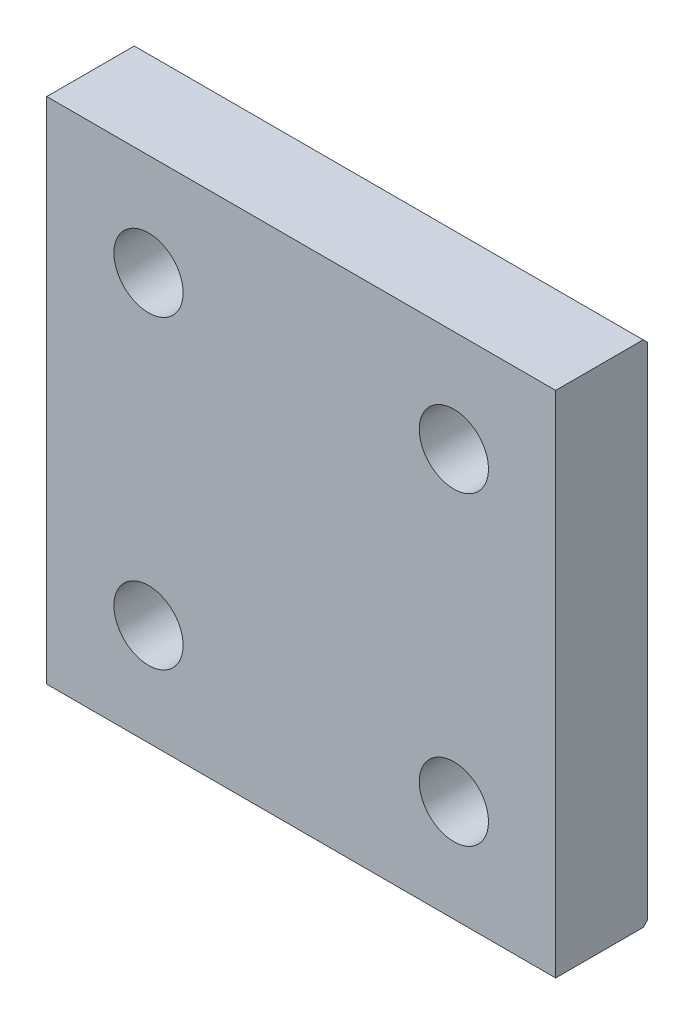
ISO-10303-21;
HEADER;
FILE_DESCRIPTION(('STEP AP214'),'2;1');
FILE_NAME('part.step','',(''),(''),'','','');
FILE_SCHEMA(('AUTOMOTIVE_DESIGN { 1 0 10303 214 1 1 1 1 }'));
ENDSEC;
DATA;
#1=APPLICATION_CONTEXT('core data for automotive mechanical design processes');
#2=APPLICATION_PROTOCOL_DEFINITION('international standard','automotive_design',2000,#1);
#3=PRODUCT_CONTEXT('',#1,'mechanical');
#4=PRODUCT('Part','Part','',(#3));
#5=PRODUCT_RELATED_PRODUCT_CATEGORY('part','',(#4));
#6=PRODUCT_DEFINITION_FORMATION('','',#4);
#7=PRODUCT_DEFINITION_CONTEXT('part definition',#1,'design');
#8=PRODUCT_DEFINITION('design','',#6,#7);
#9=PRODUCT_DEFINITION_SHAPE('','',#8);
#10=(LENGTH_UNIT() NAMED_UNIT(*) SI_UNIT(.MILLI.,.METRE.));
#11=(NAMED_UNIT(*) PLANE_ANGLE_UNIT() SI_UNIT($,.RADIAN.));
#12=(NAMED_UNIT(*) SI_UNIT($,.STERADIAN.) SOLID_ANGLE_UNIT());
#13=UNCERTAINTY_MEASURE_WITH_UNIT(LENGTH_MEASURE(1.E-05),#10,'distance_accuracy_value','');
#14=(GEOMETRIC_REPRESENTATION_CONTEXT(3) GLOBAL_UNCERTAINTY_ASSIGNED_CONTEXT((#13)) GLOBAL_UNIT_ASSIGNED_CONTEXT((#10,
#11,#12)) REPRESENTATION_CONTEXT('',''));
#15=CARTESIAN_POINT('',(0.,0.,0.));
#16=DIRECTION('',(0.,0.,1.));
#17=DIRECTION('',(1.,0.,0.));
#18=AXIS2_PLACEMENT_3D('',#15,#16,#17);
#19=CARTESIAN_POINT('',(-7.5,-7.5,4.5));
#20=DIRECTION('',(0.,0.,-1.));
#21=DIRECTION('',(-1.,0.,0.));
#22=AXIS2_PLACEMENT_3D('',#19,#20,#21);
#23=CYLINDRICAL_SURFACE('',#22,1.7);
#24=CARTESIAN_POINT('',(-7.5,-7.5,0.200000000000005));
#25=DIRECTION('',(0.,0.,1.));
#26=DIRECTION('',(1.,0.,0.));
#27=AXIS2_PLACEMENT_3D('',#24,#25,#26);
#28=CIRCLE('',#27,1.7);
#29=CARTESIAN_POINT('',(-9.2,-7.5,0.200000000000005));
#30=VERTEX_POINT('',#29);
#31=EDGE_CURVE('E157',#30,#30,#28,.F.);
#32=ORIENTED_EDGE('',*,*,#31,.T.);
#33=EDGE_LOOP('',(#32));
#34=FACE_BOUND('',#33,.T.);
#35=CARTESIAN_POINT('',(-7.5,-7.5,4.5));
#36=DIRECTION('',(0.,0.,-1.));
#37=DIRECTION('',(-1.,0.,0.));
#38=AXIS2_PLACEMENT_3D('',#35,#36,#37);
#39=CIRCLE('',#38,1.7);
#40=CARTESIAN_POINT('',(-9.2,-7.5,4.5));
#41=VERTEX_POINT('',#40);
#42=EDGE_CURVE('E123',#41,#41,#39,.T.);
#43=ORIENTED_EDGE('',*,*,#42,.F.);
#44=EDGE_LOOP('',(#43));
#45=FACE_BOUND('',#44,.T.);
#46=ADVANCED_FACE('F37',(#34,#45),#23,.F.);
#47=CARTESIAN_POINT('',(7.5,-7.5,4.5));
#48=DIRECTION('',(0.,0.,-1.));
#49=DIRECTION('',(-1.,0.,0.));
#50=AXIS2_PLACEMENT_3D('',#47,#48,#49);
#51=CYLINDRICAL_SURFACE('',#50,1.7);
#52=CARTESIAN_POINT('',(7.5,-7.5,0.200000000000005));
#53=DIRECTION('',(0.,0.,1.));
#54=DIRECTION('',(1.,0.,0.));
#55=AXIS2_PLACEMENT_3D('',#52,#53,#54);
#56=CIRCLE('',#55,1.7);
#57=CARTESIAN_POINT('',(5.8,-7.5,0.200000000000005));
#58=VERTEX_POINT('',#57);
#59=EDGE_CURVE('E154',#58,#58,#56,.F.);
#60=ORIENTED_EDGE('',*,*,#59,.T.);
#61=EDGE_LOOP('',(#60));
#62=FACE_BOUND('',#61,.T.);
#63=CARTESIAN_POINT('',(7.5,-7.5,4.5));
#64=DIRECTION('',(0.,0.,-1.));
#65=DIRECTION('',(-1.,0.,0.));
#66=AXIS2_PLACEMENT_3D('',#63,#64,#65);
#67=CIRCLE('',#66,1.7);
#68=CARTESIAN_POINT('',(5.8,-7.5,4.5));
#69=VERTEX_POINT('',#68);
#70=EDGE_CURVE('E120',#69,#69,#67,.T.);
#71=ORIENTED_EDGE('',*,*,#70,.F.);
#72=EDGE_LOOP('',(#71));
#73=FACE_BOUND('',#72,.T.);
#74=ADVANCED_FACE('F182',(#62,#73),#51,.F.);
#75=CARTESIAN_POINT('',(-12.5,-12.5,4.5));
#76=DIRECTION('',(1.,0.,0.));
#77=DIRECTION('',(0.,0.,-1.));
#78=AXIS2_PLACEMENT_3D('',#75,#76,#77);
#79=PLANE('',#78);
#80=DIRECTION('',(0.,-1.,0.));
#81=VECTOR('',#80,1.);
#82=CARTESIAN_POINT('',(-12.5,-12.5,0.));
#83=LINE('',#82,#81);
#84=CARTESIAN_POINT('',(-12.5,12.3,0.));
#85=VERTEX_POINT('',#84);
#86=CARTESIAN_POINT('',(-12.5,-12.3,0.));
#87=VERTEX_POINT('',#86);
#88=EDGE_CURVE('E236',#85,#87,#83,.T.);
#89=ORIENTED_EDGE('',*,*,#88,.T.);
#90=DIRECTION('',(0.,0.707106781186548,-0.707106781186548));
#91=VECTOR('',#90,1.);
#92=CARTESIAN_POINT('',(-12.5,-12.5,0.200000000000001));
#93=LINE('',#92,#91);
#94=CARTESIAN_POINT('',(-12.5,-12.5,0.200000000000002));
#95=VERTEX_POINT('',#94);
#96=EDGE_CURVE('E119',#87,#95,#93,.F.);
#97=ORIENTED_EDGE('',*,*,#96,.T.);
#98=DIRECTION('',(0.,0.,-1.));
#99=VECTOR('',#98,1.);
#100=CARTESIAN_POINT('',(-12.5,-12.5,4.5));
#101=LINE('',#100,#99);
#102=CARTESIAN_POINT('',(-12.5,-12.5,4.5));
#103=VERTEX_POINT('',#102);
#104=EDGE_CURVE('E98',#103,#95,#101,.T.);
#105=ORIENTED_EDGE('',*,*,#104,.F.);
#106=DIRECTION('',(0.,-1.,0.));
#107=VECTOR('',#106,1.);
#108=CARTESIAN_POINT('',(-12.5,-12.5,4.5));
#109=LINE('',#108,#107);
#110=CARTESIAN_POINT('',(-12.5,12.5,4.5));
#111=VERTEX_POINT('',#110);
#112=EDGE_CURVE('E105',#111,#103,#109,.T.);
#113=ORIENTED_EDGE('',*,*,#112,.F.);
#114=DIRECTION('',(0.,0.,-1.));
#115=VECTOR('',#114,1.);
#116=CARTESIAN_POINT('',(-12.5,12.5,4.5));
#117=LINE('',#116,#115);
#118=CARTESIAN_POINT('',(-12.5,12.5,0.200000000000002));
#119=VERTEX_POINT('',#118);
#120=EDGE_CURVE('E242',#111,#119,#117,.T.);
#121=ORIENTED_EDGE('',*,*,#120,.T.);
#122=DIRECTION('',(0.,0.707106781186548,0.707106781186548));
#123=VECTOR('',#122,1.);
#124=CARTESIAN_POINT('',(-12.5,12.5,0.200000000000004));
#125=LINE('',#124,#123);
#126=EDGE_CURVE('E53',#119,#85,#125,.F.);
#127=ORIENTED_EDGE('',*,*,#126,.T.);
#128=EDGE_LOOP('',(#89,#97,#105,#113,#121,#127));
#129=FACE_BOUND('',#128,.T.);
#130=ADVANCED_FACE('F117',(#129),#79,.F.);
#131=CARTESIAN_POINT('',(12.5,-12.5,4.5));
#132=DIRECTION('',(0.,1.,0.));
#133=DIRECTION('',(-1.,0.,0.));
#134=AXIS2_PLACEMENT_3D('',#131,#132,#133);
#135=PLANE('',#134);
#136=ORIENTED_EDGE('',*,*,#104,.T.);
#137=DIRECTION('',(1.,0.,0.));
#138=VECTOR('',#137,1.);
#139=CARTESIAN_POINT('',(12.5,-12.5,0.200000000000002));
#140=LINE('',#139,#138);
#141=CARTESIAN_POINT('',(12.5,-12.5,0.200000000000002));
#142=VERTEX_POINT('',#141);
#143=EDGE_CURVE('E131',#95,#142,#140,.T.);
#144=ORIENTED_EDGE('',*,*,#143,.T.);
#145=DIRECTION('',(0.,0.,-1.));
#146=VECTOR('',#145,1.);
#147=CARTESIAN_POINT('',(12.5,-12.5,4.5));
#148=LINE('',#147,#146);
#149=CARTESIAN_POINT('',(12.5,-12.5,4.5));
#150=VERTEX_POINT('',#149);
#151=EDGE_CURVE('E101',#150,#142,#148,.T.);
#152=ORIENTED_EDGE('',*,*,#151,.F.);
#153=DIRECTION('',(1.,0.,0.));
#154=VECTOR('',#153,1.);
#155=CARTESIAN_POINT('',(12.5,-12.5,4.5));
#156=LINE('',#155,#154);
#157=EDGE_CURVE('E93',#103,#150,#156,.T.);
#158=ORIENTED_EDGE('',*,*,#157,.F.);
#159=EDGE_LOOP('',(#136,#144,#152,#158));
#160=FACE_BOUND('',#159,.T.);
#161=ADVANCED_FACE('F95',(#160),#135,.F.);
#162=CARTESIAN_POINT('',(12.5,-12.5,4.5));
#163=DIRECTION('',(-1.,0.,0.));
#164=DIRECTION('',(0.,0.,1.));
#165=AXIS2_PLACEMENT_3D('',#162,#163,#164);
#166=PLANE('',#165);
#167=ORIENTED_EDGE('',*,*,#151,.T.);
#168=DIRECTION('',(0.,-0.707106781186548,0.707106781186548));
#169=VECTOR('',#168,1.);
#170=CARTESIAN_POINT('',(12.5,-12.5,0.200000000000002));
#171=LINE('',#170,#169);
#172=CARTESIAN_POINT('',(12.5,-12.3,0.));
#173=VERTEX_POINT('',#172);
#174=EDGE_CURVE('E135',#142,#173,#171,.F.);
#175=ORIENTED_EDGE('',*,*,#174,.T.);
#176=DIRECTION('',(0.,1.,0.));
#177=VECTOR('',#176,1.);
#178=CARTESIAN_POINT('',(12.5,-12.5,0.));
#179=LINE('',#178,#177);
#180=CARTESIAN_POINT('',(12.5,12.3,0.));
#181=VERTEX_POINT('',#180);
#182=EDGE_CURVE('E115',#173,#181,#179,.T.);
#183=ORIENTED_EDGE('',*,*,#182,.T.);
#184=DIRECTION('',(0.,-0.707106781186548,-0.707106781186548));
#185=VECTOR('',#184,1.);
#186=CARTESIAN_POINT('',(12.5,12.5,0.200000000000002));
#187=LINE('',#186,#185);
#188=CARTESIAN_POINT('',(12.5,12.5,0.200000000000002));
#189=VERTEX_POINT('',#188);
#190=EDGE_CURVE('E133',#181,#189,#187,.F.);
#191=ORIENTED_EDGE('',*,*,#190,.T.);
#192=DIRECTION('',(0.,0.,-1.));
#193=VECTOR('',#192,1.);
#194=CARTESIAN_POINT('',(12.5,12.5,4.5));
#195=LINE('',#194,#193);
#196=CARTESIAN_POINT('',(12.5,12.5,4.5));
#197=VERTEX_POINT('',#196);
#198=EDGE_CURVE('E125',#197,#189,#195,.T.);
#199=ORIENTED_EDGE('',*,*,#198,.F.);
#200=DIRECTION('',(0.,1.,0.));
#201=VECTOR('',#200,1.);
#202=CARTESIAN_POINT('',(12.5,-12.5,4.5));
#203=LINE('',#202,#201);
#204=EDGE_CURVE('E104',#150,#197,#203,.T.);
#205=ORIENTED_EDGE('',*,*,#204,.F.);
#206=EDGE_LOOP('',(#167,#175,#183,#191,#199,#205));
#207=FACE_BOUND('',#206,.T.);
#208=ADVANCED_FACE('F238',(#207),#166,.F.);
#209=CARTESIAN_POINT('',(12.5,12.5,4.5));
#210=DIRECTION('',(0.,-1.,0.));
#211=DIRECTION('',(1.,0.,0.));
#212=AXIS2_PLACEMENT_3D('',#209,#210,#211);
#213=PLANE('',#212);
#214=ORIENTED_EDGE('',*,*,#198,.T.);
#215=DIRECTION('',(-1.,0.,0.));
#216=VECTOR('',#215,1.);
#217=CARTESIAN_POINT('',(12.5,12.5,0.200000000000002));
#218=LINE('',#217,#216);
#219=EDGE_CURVE('E11',#189,#119,#218,.T.);
#220=ORIENTED_EDGE('',*,*,#219,.T.);
#221=ORIENTED_EDGE('',*,*,#120,.F.);
#222=DIRECTION('',(-1.,0.,0.));
#223=VECTOR('',#222,1.);
#224=CARTESIAN_POINT('',(12.5,12.5,4.5));
#225=LINE('',#224,#223);
#226=EDGE_CURVE('E111',#197,#111,#225,.T.);
#227=ORIENTED_EDGE('',*,*,#226,.F.);
#228=EDGE_LOOP('',(#214,#220,#221,#227));
#229=FACE_BOUND('',#228,.T.);
#230=ADVANCED_FACE('F248',(#229),#213,.F.);
#231=CARTESIAN_POINT('',(0.,0.,4.5));
#232=DIRECTION('',(0.,0.,1.));
#233=DIRECTION('',(1.,0.,0.));
#234=AXIS2_PLACEMENT_3D('',#231,#232,#233);
#235=PLANE('',#234);
#236=CARTESIAN_POINT('',(-7.5,7.5,4.5));
#237=DIRECTION('',(0.,0.,-1.));
#238=DIRECTION('',(-1.,0.,0.));
#239=AXIS2_PLACEMENT_3D('',#236,#237,#238);
#240=CIRCLE('',#239,1.7);
#241=CARTESIAN_POINT('',(-9.2,7.5,4.5));
#242=VERTEX_POINT('',#241);
#243=EDGE_CURVE('E354',#242,#242,#240,.T.);
#244=ORIENTED_EDGE('',*,*,#243,.T.);
#245=EDGE_LOOP('',(#244));
#246=FACE_BOUND('',#245,.T.);
#247=CARTESIAN_POINT('',(7.5,7.5,4.5));
#248=DIRECTION('',(0.,0.,-1.));
#249=DIRECTION('',(-1.,0.,0.));
#250=AXIS2_PLACEMENT_3D('',#247,#248,#249);
#251=CIRCLE('',#250,1.7);
#252=CARTESIAN_POINT('',(5.8,7.5,4.5));
#253=VERTEX_POINT('',#252);
#254=EDGE_CURVE('E245',#253,#253,#251,.T.);
#255=ORIENTED_EDGE('',*,*,#254,.T.);
#256=EDGE_LOOP('',(#255));
#257=FACE_BOUND('',#256,.T.);
#258=ORIENTED_EDGE('',*,*,#112,.T.);
#259=ORIENTED_EDGE('',*,*,#157,.T.);
#260=ORIENTED_EDGE('',*,*,#204,.T.);
#261=ORIENTED_EDGE('',*,*,#226,.T.);
#262=EDGE_LOOP('',(#258,#259,#260,#261));
#263=FACE_BOUND('',#262,.T.);
#264=ORIENTED_EDGE('',*,*,#70,.T.);
#265=EDGE_LOOP('',(#264));
#266=FACE_BOUND('',#265,.T.);
#267=ORIENTED_EDGE('',*,*,#42,.T.);
#268=EDGE_LOOP('',(#267));
#269=FACE_BOUND('',#268,.T.);
#270=ADVANCED_FACE('F108',(#246,#257,#263,#266,#269),#235,.T.);
#271=CARTESIAN_POINT('',(0.,0.,0.));
#272=DIRECTION('',(0.,0.,1.));
#273=DIRECTION('',(1.,0.,0.));
#274=AXIS2_PLACEMENT_3D('',#271,#272,#273);
#275=PLANE('',#274);
#276=CARTESIAN_POINT('',(7.5,-7.5,0.));
#277=DIRECTION('',(0.,0.,1.));
#278=DIRECTION('',(1.,0.,0.));
#279=AXIS2_PLACEMENT_3D('',#276,#277,#278);
#280=CIRCLE('',#279,1.90000000000001);
#281=CARTESIAN_POINT('',(5.59999999999999,-7.5,0.));
#282=VERTEX_POINT('',#281);
#283=EDGE_CURVE('E148',#282,#282,#280,.T.);
#284=ORIENTED_EDGE('',*,*,#283,.T.);
#285=EDGE_LOOP('',(#284));
#286=FACE_BOUND('',#285,.T.);
#287=CARTESIAN_POINT('',(-7.5,-7.5,0.));
#288=DIRECTION('',(0.,0.,1.));
#289=DIRECTION('',(1.,0.,0.));
#290=AXIS2_PLACEMENT_3D('',#287,#288,#289);
#291=CIRCLE('',#290,1.90000000000001);
#292=CARTESIAN_POINT('',(-9.40000000000001,-7.5,0.));
#293=VERTEX_POINT('',#292);
#294=EDGE_CURVE('E145',#293,#293,#291,.T.);
#295=ORIENTED_EDGE('',*,*,#294,.T.);
#296=EDGE_LOOP('',(#295));
#297=FACE_BOUND('',#296,.T.);
#298=CARTESIAN_POINT('',(-7.5,7.5,0.));
#299=DIRECTION('',(0.,0.,1.));
#300=DIRECTION('',(1.,0.,0.));
#301=AXIS2_PLACEMENT_3D('',#298,#299,#300);
#302=CIRCLE('',#301,1.90000000000001);
#303=CARTESIAN_POINT('',(-9.40000000000001,7.5,0.));
#304=VERTEX_POINT('',#303);
#305=EDGE_CURVE('E142',#304,#304,#302,.T.);
#306=ORIENTED_EDGE('',*,*,#305,.T.);
#307=EDGE_LOOP('',(#306));
#308=FACE_BOUND('',#307,.T.);
#309=CARTESIAN_POINT('',(7.5,7.5,0.));
#310=DIRECTION('',(0.,0.,1.));
#311=DIRECTION('',(1.,0.,0.));
#312=AXIS2_PLACEMENT_3D('',#309,#310,#311);
#313=CIRCLE('',#312,1.90000000000001);
#314=CARTESIAN_POINT('',(5.59999999999999,7.5,0.));
#315=VERTEX_POINT('',#314);
#316=EDGE_CURVE('E139',#315,#315,#313,.T.);
#317=ORIENTED_EDGE('',*,*,#316,.T.);
#318=EDGE_LOOP('',(#317));
#319=FACE_BOUND('',#318,.T.);
#320=ORIENTED_EDGE('',*,*,#182,.F.);
#321=DIRECTION('',(-1.,0.,0.));
#322=VECTOR('',#321,1.);
#323=CARTESIAN_POINT('',(0.,-12.3,0.));
#324=LINE('',#323,#322);
#325=EDGE_CURVE('E60',#173,#87,#324,.T.);
#326=ORIENTED_EDGE('',*,*,#325,.T.);
#327=ORIENTED_EDGE('',*,*,#88,.F.);
#328=DIRECTION('',(1.,0.,0.));
#329=VECTOR('',#328,1.);
#330=CARTESIAN_POINT('',(0.,12.3,0.));
#331=LINE('',#330,#329);
#332=EDGE_CURVE('E137',#85,#181,#331,.T.);
#333=ORIENTED_EDGE('',*,*,#332,.T.);
#334=EDGE_LOOP('',(#320,#326,#327,#333));
#335=FACE_BOUND('',#334,.T.);
#336=ADVANCED_FACE('F226',(#286,#297,#308,#319,#335),#275,.F.);
#337=CARTESIAN_POINT('',(7.5,7.5,4.5));
#338=DIRECTION('',(0.,0.,-1.));
#339=DIRECTION('',(-1.,0.,0.));
#340=AXIS2_PLACEMENT_3D('',#337,#338,#339);
#341=CYLINDRICAL_SURFACE('',#340,1.7);
#342=CARTESIAN_POINT('',(7.5,7.5,0.200000000000005));
#343=DIRECTION('',(0.,0.,1.));
#344=DIRECTION('',(1.,0.,0.));
#345=AXIS2_PLACEMENT_3D('',#342,#343,#344);
#346=CIRCLE('',#345,1.7);
#347=CARTESIAN_POINT('',(5.8,7.5,0.200000000000005));
#348=VERTEX_POINT('',#347);
#349=EDGE_CURVE('E46',#348,#348,#346,.F.);
#350=ORIENTED_EDGE('',*,*,#349,.T.);
#351=EDGE_LOOP('',(#350));
#352=FACE_BOUND('',#351,.T.);
#353=ORIENTED_EDGE('',*,*,#254,.F.);
#354=EDGE_LOOP('',(#353));
#355=FACE_BOUND('',#354,.T.);
#356=ADVANCED_FACE('F165',(#352,#355),#341,.F.);
#357=CARTESIAN_POINT('',(-7.5,7.5,4.5));
#358=DIRECTION('',(0.,0.,-1.));
#359=DIRECTION('',(-1.,0.,0.));
#360=AXIS2_PLACEMENT_3D('',#357,#358,#359);
#361=CYLINDRICAL_SURFACE('',#360,1.7);
#362=CARTESIAN_POINT('',(-7.5,7.5,0.200000000000005));
#363=DIRECTION('',(0.,0.,1.));
#364=DIRECTION('',(1.,0.,0.));
#365=AXIS2_PLACEMENT_3D('',#362,#363,#364);
#366=CIRCLE('',#365,1.7);
#367=CARTESIAN_POINT('',(-9.2,7.5,0.200000000000005));
#368=VERTEX_POINT('',#367);
#369=EDGE_CURVE('E160',#368,#368,#366,.F.);
#370=ORIENTED_EDGE('',*,*,#369,.T.);
#371=EDGE_LOOP('',(#370));
#372=FACE_BOUND('',#371,.T.);
#373=ORIENTED_EDGE('',*,*,#243,.F.);
#374=EDGE_LOOP('',(#373));
#375=FACE_BOUND('',#374,.T.);
#376=ADVANCED_FACE('F201',(#372,#375),#361,.F.);
#377=CARTESIAN_POINT('',(12.5,-12.5,0.200000000000002));
#378=DIRECTION('',(0.,0.707106781186547,0.707106781186547));
#379=DIRECTION('',(1.,0.,0.));
#380=AXIS2_PLACEMENT_3D('',#377,#378,#379);
#381=PLANE('',#380);
#382=ORIENTED_EDGE('',*,*,#96,.F.);
#383=ORIENTED_EDGE('',*,*,#325,.F.);
#384=ORIENTED_EDGE('',*,*,#174,.F.);
#385=ORIENTED_EDGE('',*,*,#143,.F.);
#386=EDGE_LOOP('',(#382,#383,#384,#385));
#387=FACE_BOUND('',#386,.T.);
#388=ADVANCED_FACE('F194',(#387),#381,.F.);
#389=CARTESIAN_POINT('',(7.5,-7.5,0.200000000000005));
#390=DIRECTION('',(0.,0.,-1.));
#391=DIRECTION('',(-1.,0.,0.));
#392=AXIS2_PLACEMENT_3D('',#389,#390,#391);
#393=CONICAL_SURFACE('',#392,1.7,0.785398163397452);
#394=CARTESIAN_POINT('',(5.59999999999999,-7.5,0.));
#395=CARTESIAN_POINT('',(5.60208333333333,-7.5,0.00208333333333336));
#396=CARTESIAN_POINT('',(5.60416666666666,-7.5,0.00416666666666674));
#397=CARTESIAN_POINT('',(5.60833333333333,-7.5,0.00833333333333351));
#398=CARTESIAN_POINT('',(5.61041666666666,-7.5,0.0104166666666669));
#399=CARTESIAN_POINT('',(5.61458333333333,-7.5,0.0145833333333337));
#400=CARTESIAN_POINT('',(5.61666666666666,-7.5,0.016666666666667));
#401=CARTESIAN_POINT('',(5.62083333333333,-7.5,0.0208333333333338));
#402=CARTESIAN_POINT('',(5.62291666666666,-7.5,0.0229166666666672));
#403=CARTESIAN_POINT('',(5.62708333333333,-7.5,0.027083333333334));
#404=CARTESIAN_POINT('',(5.62916666666666,-7.5,0.0291666666666674));
#405=CARTESIAN_POINT('',(5.63333333333333,-7.5,0.0333333333333341));
#406=CARTESIAN_POINT('',(5.63541666666666,-7.5,0.0354166666666675));
#407=CARTESIAN_POINT('',(5.63958333333333,-7.5,0.0395833333333343));
#408=CARTESIAN_POINT('',(5.64166666666666,-7.5,0.0416666666666677));
#409=CARTESIAN_POINT('',(5.64583333333333,-7.5,0.0458333333333344));
#410=CARTESIAN_POINT('',(5.64791666666666,-7.5,0.0479166666666678));
#411=CARTESIAN_POINT('',(5.65208333333333,-7.5,0.0520833333333346));
#412=CARTESIAN_POINT('',(5.65416666666666,-7.5,0.054166666666668));
#413=CARTESIAN_POINT('',(5.65833333333333,-7.5,0.0583333333333347));
#414=CARTESIAN_POINT('',(5.66041666666666,-7.5,0.0604166666666681));
#415=CARTESIAN_POINT('',(5.66458333333333,-7.5,0.0645833333333349));
#416=CARTESIAN_POINT('',(5.66666666666666,-7.5,0.0666666666666683));
#417=CARTESIAN_POINT('',(5.67083333333333,-7.5,0.0708333333333351));
#418=CARTESIAN_POINT('',(5.67291666666666,-7.5,0.0729166666666684));
#419=CARTESIAN_POINT('',(5.67708333333333,-7.5,0.0770833333333352));
#420=CARTESIAN_POINT('',(5.67916666666666,-7.5,0.0791666666666686));
#421=CARTESIAN_POINT('',(5.68333333333333,-7.5,0.0833333333333353));
#422=CARTESIAN_POINT('',(5.68541666666666,-7.5,0.0854166666666687));
#423=CARTESIAN_POINT('',(5.68958333333333,-7.5,0.0895833333333355));
#424=CARTESIAN_POINT('',(5.69166666666666,-7.5,0.0916666666666689));
#425=CARTESIAN_POINT('',(5.69583333333333,-7.5,0.0958333333333356));
#426=CARTESIAN_POINT('',(5.69791666666666,-7.5,0.097916666666669));
#427=CARTESIAN_POINT('',(5.70208333333333,-7.5,0.102083333333336));
#428=CARTESIAN_POINT('',(5.70416666666666,-7.5,0.104166666666669));
#429=CARTESIAN_POINT('',(5.70833333333333,-7.5,0.108333333333336));
#430=CARTESIAN_POINT('',(5.71041666666666,-7.5,0.110416666666669));
#431=CARTESIAN_POINT('',(5.71458333333333,-7.5,0.114583333333336));
#432=CARTESIAN_POINT('',(5.71666666666667,-7.5,0.116666666666669));
#433=CARTESIAN_POINT('',(5.72083333333333,-7.5,0.120833333333336));
#434=CARTESIAN_POINT('',(5.72291666666666,-7.5,0.12291666666667));
#435=CARTESIAN_POINT('',(5.72708333333333,-7.5,0.127083333333337));
#436=CARTESIAN_POINT('',(5.72916666666667,-7.5,0.12916666666667));
#437=CARTESIAN_POINT('',(5.73333333333333,-7.5,0.133333333333336));
#438=CARTESIAN_POINT('',(5.73541666666666,-7.5,0.13541666666667));
#439=CARTESIAN_POINT('',(5.73958333333333,-7.5,0.139583333333337));
#440=CARTESIAN_POINT('',(5.74166666666667,-7.5,0.14166666666667));
#441=CARTESIAN_POINT('',(5.74583333333333,-7.5,0.145833333333337));
#442=CARTESIAN_POINT('',(5.74791666666667,-7.5,0.14791666666667));
#443=CARTESIAN_POINT('',(5.75208333333333,-7.5,0.152083333333337));
#444=CARTESIAN_POINT('',(5.75416666666667,-7.5,0.15416666666667));
#445=CARTESIAN_POINT('',(5.75833333333333,-7.5,0.158333333333337));
#446=CARTESIAN_POINT('',(5.76041666666667,-7.5,0.160416666666671));
#447=CARTESIAN_POINT('',(5.76458333333333,-7.5,0.164583333333337));
#448=CARTESIAN_POINT('',(5.76666666666667,-7.5,0.166666666666671));
#449=CARTESIAN_POINT('',(5.77083333333333,-7.5,0.170833333333337));
#450=CARTESIAN_POINT('',(5.77291666666667,-7.5,0.172916666666671));
#451=CARTESIAN_POINT('',(5.77708333333333,-7.5,0.177083333333338));
#452=CARTESIAN_POINT('',(5.77916666666667,-7.5,0.179166666666671));
#453=CARTESIAN_POINT('',(5.78333333333333,-7.5,0.183333333333338));
#454=CARTESIAN_POINT('',(5.78541666666667,-7.5,0.185416666666671));
#455=CARTESIAN_POINT('',(5.78958333333333,-7.5,0.189583333333338));
#456=CARTESIAN_POINT('',(5.79166666666667,-7.5,0.191666666666671));
#457=CARTESIAN_POINT('',(5.79583333333333,-7.5,0.195833333333338));
#458=CARTESIAN_POINT('',(5.79791666666667,-7.5,0.197916666666671));
#459=CARTESIAN_POINT('',(5.8,-7.5,0.200000000000005));
#460=B_SPLINE_CURVE_WITH_KNOTS('',3,(#394,#395,#396,#397,#398,#399,#400,#401,#402,#403,#404,
#405,#406,#407,#408,#409,#410,#411,#412,#413,#414,#415,#416,#417,#418,#419,#420,#421,#422,#423,
#424,#425,#426,#427,#428,#429,#430,#431,#432,#433,#434,#435,#436,#437,#438,#439,#440,#441,#442,
#443,#444,#445,#446,#447,#448,#449,#450,#451,#452,#453,#454,#455,#456,#457,#458,#459),
.UNSPECIFIED.,.F.,.F.,(4,2,2,2,2,2,2,2,2,2,2,2,2,2,2,2,2,2,2,2,2,2,2,2,2,2,2,2,2,2,2,2,4),(0.,
0.00883883476483208,0.0176776695296642,0.0265165042944962,0.0353553390593283,0.0441941738241604,
0.0530330085889925,0.0618718433538245,0.0707106781186566,0.0795495128834887,0.0883883476483208,
0.0972271824131529,0.106066017177985,0.114904851942817,0.123743686707649,0.132582521472481,
0.141421356237313,0.150260191002145,0.159099025766977,0.16793786053181,0.176776695296642,
0.185615530061474,0.194454364826306,0.203293199591138,0.21213203435597,0.220970869120803,
0.229809703885634,0.238648538650467,0.247487373415298,0.256326208180131,0.265165042944963,
0.274003877709795,0.282842712474627),.UNSPECIFIED.);
#461=EDGE_CURVE('BSEAM200',#282,#58,#460,.T.);
#462=ORIENTED_EDGE('',*,*,#283,.F.);
#463=ORIENTED_EDGE('',*,*,#59,.F.);
#464=ORIENTED_EDGE('',*,*,#461,.T.);
#465=ORIENTED_EDGE('',*,*,#461,.F.);
#466=EDGE_LOOP('',(#462,#464,#463,#465));
#467=FACE_BOUND('',#466,.T.);
#468=ADVANCED_FACE('F200',(#467),#393,.F.);
#469=CARTESIAN_POINT('',(-7.5,-7.5,0.200000000000005));
#470=DIRECTION('',(0.,0.,-1.));
#471=DIRECTION('',(-1.,0.,0.));
#472=AXIS2_PLACEMENT_3D('',#469,#470,#471);
#473=CONICAL_SURFACE('',#472,1.7,0.78539816339745);
#474=CARTESIAN_POINT('',(-9.40000000000001,-7.5,0.));
#475=CARTESIAN_POINT('',(-9.39791666666667,-7.5,0.0020833333333335));
#476=CARTESIAN_POINT('',(-9.39583333333334,-7.5,0.00416666666666681));
#477=CARTESIAN_POINT('',(-9.39166666666667,-7.5,0.00833333333333344));
#478=CARTESIAN_POINT('',(-9.38958333333334,-7.5,0.0104166666666667));
#479=CARTESIAN_POINT('',(-9.38541666666667,-7.5,0.0145833333333335));
#480=CARTESIAN_POINT('',(-9.38333333333334,-7.5,0.016666666666667));
#481=CARTESIAN_POINT('',(-9.37916666666667,-7.5,0.0208333333333339));
#482=CARTESIAN_POINT('',(-9.37708333333334,-7.5,0.0229166666666673));
#483=CARTESIAN_POINT('',(-9.37291666666667,-7.5,0.0270833333333341));
#484=CARTESIAN_POINT('',(-9.37083333333334,-7.5,0.0291666666666674));
#485=CARTESIAN_POINT('',(-9.36666666666667,-7.5,0.033333333333334));
#486=CARTESIAN_POINT('',(-9.36458333333334,-7.5,0.0354166666666674));
#487=CARTESIAN_POINT('',(-9.36041666666667,-7.5,0.0395833333333341));
#488=CARTESIAN_POINT('',(-9.35833333333334,-7.5,0.0416666666666676));
#489=CARTESIAN_POINT('',(-9.35416666666667,-7.5,0.0458333333333345));
#490=CARTESIAN_POINT('',(-9.35208333333334,-7.5,0.047916666666668));
#491=CARTESIAN_POINT('',(-9.34791666666667,-7.5,0.0520833333333347));
#492=CARTESIAN_POINT('',(-9.34583333333334,-7.5,0.0541666666666678));
#493=CARTESIAN_POINT('',(-9.34166666666667,-7.5,0.0583333333333346));
#494=CARTESIAN_POINT('',(-9.33958333333334,-7.5,0.0604166666666683));
#495=CARTESIAN_POINT('',(-9.33541666666667,-7.5,0.064583333333335));
#496=CARTESIAN_POINT('',(-9.33333333333334,-7.5,0.0666666666666681));
#497=CARTESIAN_POINT('',(-9.32916666666667,-7.5,0.0708333333333349));
#498=CARTESIAN_POINT('',(-9.32708333333334,-7.5,0.0729166666666686));
#499=CARTESIAN_POINT('',(-9.32291666666667,-7.5,0.0770833333333353));
#500=CARTESIAN_POINT('',(-9.32083333333333,-7.5,0.0791666666666684));
#501=CARTESIAN_POINT('',(-9.31666666666667,-7.5,0.0833333333333352));
#502=CARTESIAN_POINT('',(-9.31458333333334,-7.5,0.0854166666666689));
#503=CARTESIAN_POINT('',(-9.31041666666667,-7.5,0.0895833333333356));
#504=CARTESIAN_POINT('',(-9.30833333333334,-7.5,0.0916666666666687));
#505=CARTESIAN_POINT('',(-9.30416666666667,-7.5,0.0958333333333355));
#506=CARTESIAN_POINT('',(-9.30208333333334,-7.5,0.0979166666666692));
#507=CARTESIAN_POINT('',(-9.29791666666667,-7.5,0.102083333333336));
#508=CARTESIAN_POINT('',(-9.29583333333333,-7.5,0.104166666666669));
#509=CARTESIAN_POINT('',(-9.29166666666667,-7.5,0.108333333333336));
#510=CARTESIAN_POINT('',(-9.28958333333333,-7.5,0.110416666666669));
#511=CARTESIAN_POINT('',(-9.28541666666667,-7.5,0.114583333333336));
#512=CARTESIAN_POINT('',(-9.28333333333333,-7.5,0.116666666666669));
#513=CARTESIAN_POINT('',(-9.27916666666667,-7.5,0.120833333333336));
#514=CARTESIAN_POINT('',(-9.27708333333334,-7.5,0.12291666666667));
#515=CARTESIAN_POINT('',(-9.27291666666667,-7.5,0.127083333333337));
#516=CARTESIAN_POINT('',(-9.27083333333333,-7.5,0.12916666666667));
#517=CARTESIAN_POINT('',(-9.26666666666667,-7.5,0.133333333333336));
#518=CARTESIAN_POINT('',(-9.26458333333333,-7.5,0.13541666666667));
#519=CARTESIAN_POINT('',(-9.26041666666667,-7.5,0.139583333333337));
#520=CARTESIAN_POINT('',(-9.25833333333333,-7.5,0.14166666666667));
#521=CARTESIAN_POINT('',(-9.25416666666667,-7.5,0.145833333333337));
#522=CARTESIAN_POINT('',(-9.25208333333333,-7.5,0.14791666666667));
#523=CARTESIAN_POINT('',(-9.24791666666667,-7.5,0.152083333333337));
#524=CARTESIAN_POINT('',(-9.24583333333333,-7.5,0.15416666666667));
#525=CARTESIAN_POINT('',(-9.24166666666667,-7.5,0.158333333333337));
#526=CARTESIAN_POINT('',(-9.23958333333333,-7.5,0.160416666666671));
#527=CARTESIAN_POINT('',(-9.23541666666667,-7.5,0.164583333333337));
#528=CARTESIAN_POINT('',(-9.23333333333333,-7.5,0.166666666666671));
#529=CARTESIAN_POINT('',(-9.22916666666667,-7.5,0.170833333333337));
#530=CARTESIAN_POINT('',(-9.22708333333333,-7.5,0.172916666666671));
#531=CARTESIAN_POINT('',(-9.22291666666667,-7.5,0.177083333333338));
#532=CARTESIAN_POINT('',(-9.22083333333333,-7.5,0.179166666666671));
#533=CARTESIAN_POINT('',(-9.21666666666667,-7.5,0.183333333333338));
#534=CARTESIAN_POINT('',(-9.21458333333333,-7.5,0.185416666666671));
#535=CARTESIAN_POINT('',(-9.21041666666667,-7.5,0.189583333333338));
#536=CARTESIAN_POINT('',(-9.20833333333333,-7.5,0.191666666666671));
#537=CARTESIAN_POINT('',(-9.20416666666667,-7.5,0.195833333333338));
#538=CARTESIAN_POINT('',(-9.20208333333333,-7.5,0.197916666666671));
#539=CARTESIAN_POINT('',(-9.2,-7.5,0.200000000000005));
#540=B_SPLINE_CURVE_WITH_KNOTS('',3,(#474,#475,#476,#477,#478,#479,#480,#481,#482,#483,#484,
#485,#486,#487,#488,#489,#490,#491,#492,#493,#494,#495,#496,#497,#498,#499,#500,#501,#502,#503,
#504,#505,#506,#507,#508,#509,#510,#511,#512,#513,#514,#515,#516,#517,#518,#519,#520,#521,#522,
#523,#524,#525,#526,#527,#528,#529,#530,#531,#532,#533,#534,#535,#536,#537,#538,#539),
.UNSPECIFIED.,.F.,.F.,(4,2,2,2,2,2,2,2,2,2,2,2,2,2,2,2,2,2,2,2,2,2,2,2,2,2,2,2,2,2,2,2,4),(0.,
0.00883883476483269,0.0176776695296654,0.0265165042944969,0.0353553390593283,0.044194173824161,
0.0530330085889937,0.0618718433538252,0.0707106781186566,0.0795495128834893,0.0883883476483208,
0.0972271824131535,0.106066017177985,0.114904851942818,0.123743686707649,0.132582521472482,
0.141421356237313,0.150260191002146,0.159099025766977,0.16793786053181,0.176776695296642,
0.185615530061474,0.194454364826306,0.203293199591138,0.21213203435597,0.220970869120803,
0.229809703885634,0.238648538650467,0.247487373415298,0.256326208180131,0.265165042944962,
0.274003877709795,0.282842712474627),.UNSPECIFIED.);
#541=EDGE_CURVE('BSEAM176',#293,#30,#540,.T.);
#542=ORIENTED_EDGE('',*,*,#294,.F.);
#543=ORIENTED_EDGE('',*,*,#31,.F.);
#544=ORIENTED_EDGE('',*,*,#541,.T.);
#545=ORIENTED_EDGE('',*,*,#541,.F.);
#546=EDGE_LOOP('',(#542,#544,#543,#545));
#547=FACE_BOUND('',#546,.T.);
#548=ADVANCED_FACE('F176',(#547),#473,.F.);
#549=CARTESIAN_POINT('',(-7.5,7.5,0.200000000000005));
#550=DIRECTION('',(0.,0.,-1.));
#551=DIRECTION('',(-1.,0.,0.));
#552=AXIS2_PLACEMENT_3D('',#549,#550,#551);
#553=CONICAL_SURFACE('',#552,1.7,0.78539816339745);
#554=CARTESIAN_POINT('',(-9.40000000000001,7.5,0.));
#555=CARTESIAN_POINT('',(-9.39791666666667,7.5,0.0020833333333335));
#556=CARTESIAN_POINT('',(-9.39583333333334,7.5,0.00416666666666681));
#557=CARTESIAN_POINT('',(-9.39166666666667,7.5,0.00833333333333344));
#558=CARTESIAN_POINT('',(-9.38958333333334,7.5,0.0104166666666667));
#559=CARTESIAN_POINT('',(-9.38541666666667,7.5,0.0145833333333335));
#560=CARTESIAN_POINT('',(-9.38333333333334,7.5,0.016666666666667));
#561=CARTESIAN_POINT('',(-9.37916666666667,7.5,0.0208333333333339));
#562=CARTESIAN_POINT('',(-9.37708333333334,7.5,0.0229166666666673));
#563=CARTESIAN_POINT('',(-9.37291666666667,7.5,0.0270833333333341));
#564=CARTESIAN_POINT('',(-9.37083333333334,7.5,0.0291666666666674));
#565=CARTESIAN_POINT('',(-9.36666666666667,7.5,0.033333333333334));
#566=CARTESIAN_POINT('',(-9.36458333333334,7.5,0.0354166666666674));
#567=CARTESIAN_POINT('',(-9.36041666666667,7.5,0.0395833333333341));
#568=CARTESIAN_POINT('',(-9.35833333333334,7.5,0.0416666666666676));
#569=CARTESIAN_POINT('',(-9.35416666666667,7.5,0.0458333333333345));
#570=CARTESIAN_POINT('',(-9.35208333333334,7.5,0.047916666666668));
#571=CARTESIAN_POINT('',(-9.34791666666667,7.5,0.0520833333333347));
#572=CARTESIAN_POINT('',(-9.34583333333334,7.5,0.0541666666666678));
#573=CARTESIAN_POINT('',(-9.34166666666667,7.5,0.0583333333333346));
#574=CARTESIAN_POINT('',(-9.33958333333334,7.5,0.0604166666666683));
#575=CARTESIAN_POINT('',(-9.33541666666667,7.5,0.064583333333335));
#576=CARTESIAN_POINT('',(-9.33333333333334,7.5,0.0666666666666681));
#577=CARTESIAN_POINT('',(-9.32916666666667,7.5,0.0708333333333349));
#578=CARTESIAN_POINT('',(-9.32708333333334,7.5,0.0729166666666686));
#579=CARTESIAN_POINT('',(-9.32291666666667,7.5,0.0770833333333353));
#580=CARTESIAN_POINT('',(-9.32083333333333,7.5,0.0791666666666684));
#581=CARTESIAN_POINT('',(-9.31666666666667,7.5,0.0833333333333352));
#582=CARTESIAN_POINT('',(-9.31458333333334,7.5,0.0854166666666689));
#583=CARTESIAN_POINT('',(-9.31041666666667,7.5,0.0895833333333356));
#584=CARTESIAN_POINT('',(-9.30833333333334,7.5,0.0916666666666687));
#585=CARTESIAN_POINT('',(-9.30416666666667,7.5,0.0958333333333355));
#586=CARTESIAN_POINT('',(-9.30208333333334,7.5,0.0979166666666692));
#587=CARTESIAN_POINT('',(-9.29791666666667,7.5,0.102083333333336));
#588=CARTESIAN_POINT('',(-9.29583333333333,7.5,0.104166666666669));
#589=CARTESIAN_POINT('',(-9.29166666666667,7.5,0.108333333333336));
#590=CARTESIAN_POINT('',(-9.28958333333333,7.5,0.110416666666669));
#591=CARTESIAN_POINT('',(-9.28541666666667,7.5,0.114583333333336));
#592=CARTESIAN_POINT('',(-9.28333333333333,7.5,0.116666666666669));
#593=CARTESIAN_POINT('',(-9.27916666666667,7.5,0.120833333333336));
#594=CARTESIAN_POINT('',(-9.27708333333334,7.5,0.12291666666667));
#595=CARTESIAN_POINT('',(-9.27291666666667,7.5,0.127083333333337));
#596=CARTESIAN_POINT('',(-9.27083333333333,7.5,0.12916666666667));
#597=CARTESIAN_POINT('',(-9.26666666666667,7.5,0.133333333333336));
#598=CARTESIAN_POINT('',(-9.26458333333333,7.5,0.13541666666667));
#599=CARTESIAN_POINT('',(-9.26041666666667,7.5,0.139583333333337));
#600=CARTESIAN_POINT('',(-9.25833333333333,7.5,0.14166666666667));
#601=CARTESIAN_POINT('',(-9.25416666666667,7.5,0.145833333333337));
#602=CARTESIAN_POINT('',(-9.25208333333333,7.5,0.14791666666667));
#603=CARTESIAN_POINT('',(-9.24791666666667,7.5,0.152083333333337));
#604=CARTESIAN_POINT('',(-9.24583333333333,7.5,0.15416666666667));
#605=CARTESIAN_POINT('',(-9.24166666666667,7.5,0.158333333333337));
#606=CARTESIAN_POINT('',(-9.23958333333333,7.5,0.160416666666671));
#607=CARTESIAN_POINT('',(-9.23541666666667,7.5,0.164583333333337));
#608=CARTESIAN_POINT('',(-9.23333333333333,7.5,0.166666666666671));
#609=CARTESIAN_POINT('',(-9.22916666666667,7.5,0.170833333333337));
#610=CARTESIAN_POINT('',(-9.22708333333333,7.5,0.172916666666671));
#611=CARTESIAN_POINT('',(-9.22291666666667,7.5,0.177083333333338));
#612=CARTESIAN_POINT('',(-9.22083333333333,7.5,0.179166666666671));
#613=CARTESIAN_POINT('',(-9.21666666666667,7.5,0.183333333333338));
#614=CARTESIAN_POINT('',(-9.21458333333333,7.5,0.185416666666671));
#615=CARTESIAN_POINT('',(-9.21041666666667,7.5,0.189583333333338));
#616=CARTESIAN_POINT('',(-9.20833333333333,7.5,0.191666666666671));
#617=CARTESIAN_POINT('',(-9.20416666666667,7.5,0.195833333333338));
#618=CARTESIAN_POINT('',(-9.20208333333333,7.5,0.197916666666671));
#619=CARTESIAN_POINT('',(-9.2,7.5,0.200000000000005));
#620=B_SPLINE_CURVE_WITH_KNOTS('',3,(#554,#555,#556,#557,#558,#559,#560,#561,#562,#563,#564,
#565,#566,#567,#568,#569,#570,#571,#572,#573,#574,#575,#576,#577,#578,#579,#580,#581,#582,#583,
#584,#585,#586,#587,#588,#589,#590,#591,#592,#593,#594,#595,#596,#597,#598,#599,#600,#601,#602,
#603,#604,#605,#606,#607,#608,#609,#610,#611,#612,#613,#614,#615,#616,#617,#618,#619),
.UNSPECIFIED.,.F.,.F.,(4,2,2,2,2,2,2,2,2,2,2,2,2,2,2,2,2,2,2,2,2,2,2,2,2,2,2,2,2,2,2,2,4),(0.,
0.00883883476483269,0.0176776695296654,0.0265165042944969,0.0353553390593283,0.044194173824161,
0.0530330085889937,0.0618718433538252,0.0707106781186566,0.0795495128834893,0.0883883476483208,
0.0972271824131535,0.106066017177985,0.114904851942818,0.123743686707649,0.132582521472482,
0.141421356237313,0.150260191002146,0.159099025766977,0.16793786053181,0.176776695296642,
0.185615530061474,0.194454364826306,0.203293199591138,0.21213203435597,0.220970869120803,
0.229809703885634,0.238648538650467,0.247487373415298,0.256326208180131,0.265165042944962,
0.274003877709795,0.282842712474627),.UNSPECIFIED.);
#621=EDGE_CURVE('BSEAM170',#304,#368,#620,.T.);
#622=ORIENTED_EDGE('',*,*,#305,.F.);
#623=ORIENTED_EDGE('',*,*,#369,.F.);
#624=ORIENTED_EDGE('',*,*,#621,.T.);
#625=ORIENTED_EDGE('',*,*,#621,.F.);
#626=EDGE_LOOP('',(#622,#624,#623,#625));
#627=FACE_BOUND('',#626,.T.);
#628=ADVANCED_FACE('F170',(#627),#553,.F.);
#629=CARTESIAN_POINT('',(7.5,7.5,0.200000000000005));
#630=DIRECTION('',(0.,0.,-1.));
#631=DIRECTION('',(-1.,0.,0.));
#632=AXIS2_PLACEMENT_3D('',#629,#630,#631);
#633=CONICAL_SURFACE('',#632,1.7,0.785398163397452);
#634=CARTESIAN_POINT('',(5.59999999999999,7.5,0.));
#635=CARTESIAN_POINT('',(5.60208333333333,7.5,0.00208333333333336));
#636=CARTESIAN_POINT('',(5.60416666666666,7.5,0.00416666666666674));
#637=CARTESIAN_POINT('',(5.60833333333333,7.5,0.00833333333333351));
#638=CARTESIAN_POINT('',(5.61041666666666,7.5,0.0104166666666669));
#639=CARTESIAN_POINT('',(5.61458333333333,7.5,0.0145833333333337));
#640=CARTESIAN_POINT('',(5.61666666666666,7.5,0.016666666666667));
#641=CARTESIAN_POINT('',(5.62083333333333,7.5,0.0208333333333338));
#642=CARTESIAN_POINT('',(5.62291666666666,7.5,0.0229166666666672));
#643=CARTESIAN_POINT('',(5.62708333333333,7.5,0.027083333333334));
#644=CARTESIAN_POINT('',(5.62916666666666,7.5,0.0291666666666674));
#645=CARTESIAN_POINT('',(5.63333333333333,7.5,0.0333333333333341));
#646=CARTESIAN_POINT('',(5.63541666666666,7.5,0.0354166666666675));
#647=CARTESIAN_POINT('',(5.63958333333333,7.5,0.0395833333333343));
#648=CARTESIAN_POINT('',(5.64166666666666,7.5,0.0416666666666677));
#649=CARTESIAN_POINT('',(5.64583333333333,7.5,0.0458333333333344));
#650=CARTESIAN_POINT('',(5.64791666666666,7.5,0.0479166666666678));
#651=CARTESIAN_POINT('',(5.65208333333333,7.5,0.0520833333333346));
#652=CARTESIAN_POINT('',(5.65416666666666,7.5,0.054166666666668));
#653=CARTESIAN_POINT('',(5.65833333333333,7.5,0.0583333333333347));
#654=CARTESIAN_POINT('',(5.66041666666666,7.5,0.0604166666666681));
#655=CARTESIAN_POINT('',(5.66458333333333,7.5,0.0645833333333349));
#656=CARTESIAN_POINT('',(5.66666666666666,7.5,0.0666666666666683));
#657=CARTESIAN_POINT('',(5.67083333333333,7.5,0.0708333333333351));
#658=CARTESIAN_POINT('',(5.67291666666666,7.5,0.0729166666666684));
#659=CARTESIAN_POINT('',(5.67708333333333,7.5,0.0770833333333352));
#660=CARTESIAN_POINT('',(5.67916666666666,7.5,0.0791666666666686));
#661=CARTESIAN_POINT('',(5.68333333333333,7.5,0.0833333333333353));
#662=CARTESIAN_POINT('',(5.68541666666666,7.5,0.0854166666666687));
#663=CARTESIAN_POINT('',(5.68958333333333,7.5,0.0895833333333355));
#664=CARTESIAN_POINT('',(5.69166666666666,7.5,0.0916666666666689));
#665=CARTESIAN_POINT('',(5.69583333333333,7.5,0.0958333333333356));
#666=CARTESIAN_POINT('',(5.69791666666666,7.5,0.097916666666669));
#667=CARTESIAN_POINT('',(5.70208333333333,7.5,0.102083333333336));
#668=CARTESIAN_POINT('',(5.70416666666666,7.5,0.104166666666669));
#669=CARTESIAN_POINT('',(5.70833333333333,7.5,0.108333333333336));
#670=CARTESIAN_POINT('',(5.71041666666666,7.5,0.110416666666669));
#671=CARTESIAN_POINT('',(5.71458333333333,7.5,0.114583333333336));
#672=CARTESIAN_POINT('',(5.71666666666667,7.5,0.116666666666669));
#673=CARTESIAN_POINT('',(5.72083333333333,7.5,0.120833333333336));
#674=CARTESIAN_POINT('',(5.72291666666666,7.5,0.12291666666667));
#675=CARTESIAN_POINT('',(5.72708333333333,7.5,0.127083333333337));
#676=CARTESIAN_POINT('',(5.72916666666667,7.5,0.12916666666667));
#677=CARTESIAN_POINT('',(5.73333333333333,7.5,0.133333333333336));
#678=CARTESIAN_POINT('',(5.73541666666666,7.5,0.13541666666667));
#679=CARTESIAN_POINT('',(5.73958333333333,7.5,0.139583333333337));
#680=CARTESIAN_POINT('',(5.74166666666667,7.5,0.14166666666667));
#681=CARTESIAN_POINT('',(5.74583333333333,7.5,0.145833333333337));
#682=CARTESIAN_POINT('',(5.74791666666667,7.5,0.14791666666667));
#683=CARTESIAN_POINT('',(5.75208333333333,7.5,0.152083333333337));
#684=CARTESIAN_POINT('',(5.75416666666667,7.5,0.15416666666667));
#685=CARTESIAN_POINT('',(5.75833333333333,7.5,0.158333333333337));
#686=CARTESIAN_POINT('',(5.76041666666667,7.5,0.160416666666671));
#687=CARTESIAN_POINT('',(5.76458333333333,7.5,0.164583333333337));
#688=CARTESIAN_POINT('',(5.76666666666667,7.5,0.166666666666671));
#689=CARTESIAN_POINT('',(5.77083333333333,7.5,0.170833333333337));
#690=CARTESIAN_POINT('',(5.77291666666667,7.5,0.172916666666671));
#691=CARTESIAN_POINT('',(5.77708333333333,7.5,0.177083333333338));
#692=CARTESIAN_POINT('',(5.77916666666667,7.5,0.179166666666671));
#693=CARTESIAN_POINT('',(5.78333333333333,7.5,0.183333333333338));
#694=CARTESIAN_POINT('',(5.78541666666667,7.5,0.185416666666671));
#695=CARTESIAN_POINT('',(5.78958333333333,7.5,0.189583333333338));
#696=CARTESIAN_POINT('',(5.79166666666667,7.5,0.191666666666671));
#697=CARTESIAN_POINT('',(5.79583333333333,7.5,0.195833333333338));
#698=CARTESIAN_POINT('',(5.79791666666667,7.5,0.197916666666671));
#699=CARTESIAN_POINT('',(5.8,7.5,0.200000000000005));
#700=B_SPLINE_CURVE_WITH_KNOTS('',3,(#634,#635,#636,#637,#638,#639,#640,#641,#642,#643,#644,
#645,#646,#647,#648,#649,#650,#651,#652,#653,#654,#655,#656,#657,#658,#659,#660,#661,#662,#663,
#664,#665,#666,#667,#668,#669,#670,#671,#672,#673,#674,#675,#676,#677,#678,#679,#680,#681,#682,
#683,#684,#685,#686,#687,#688,#689,#690,#691,#692,#693,#694,#695,#696,#697,#698,#699),
.UNSPECIFIED.,.F.,.F.,(4,2,2,2,2,2,2,2,2,2,2,2,2,2,2,2,2,2,2,2,2,2,2,2,2,2,2,2,2,2,2,2,4),(0.,
0.00883883476483208,0.0176776695296642,0.0265165042944962,0.0353553390593283,0.0441941738241604,
0.0530330085889925,0.0618718433538245,0.0707106781186566,0.0795495128834887,0.0883883476483208,
0.0972271824131529,0.106066017177985,0.114904851942817,0.123743686707649,0.132582521472481,
0.141421356237313,0.150260191002145,0.159099025766977,0.16793786053181,0.176776695296642,
0.185615530061474,0.194454364826306,0.203293199591138,0.21213203435597,0.220970869120803,
0.229809703885634,0.238648538650467,0.247487373415298,0.256326208180131,0.265165042944963,
0.274003877709795,0.282842712474627),.UNSPECIFIED.);
#701=EDGE_CURVE('BSEAM168',#315,#348,#700,.T.);
#702=ORIENTED_EDGE('',*,*,#316,.F.);
#703=ORIENTED_EDGE('',*,*,#349,.F.);
#704=ORIENTED_EDGE('',*,*,#701,.T.);
#705=ORIENTED_EDGE('',*,*,#701,.F.);
#706=EDGE_LOOP('',(#702,#704,#703,#705));
#707=FACE_BOUND('',#706,.T.);
#708=ADVANCED_FACE('F168',(#707),#633,.F.);
#709=CARTESIAN_POINT('',(12.5,12.5,0.200000000000002));
#710=DIRECTION('',(0.,-0.707106781186547,0.707106781186547));
#711=DIRECTION('',(-1.,0.,0.));
#712=AXIS2_PLACEMENT_3D('',#709,#710,#711);
#713=PLANE('',#712);
#714=ORIENTED_EDGE('',*,*,#190,.F.);
#715=ORIENTED_EDGE('',*,*,#332,.F.);
#716=ORIENTED_EDGE('',*,*,#126,.F.);
#717=ORIENTED_EDGE('',*,*,#219,.F.);
#718=EDGE_LOOP('',(#714,#715,#716,#717));
#719=FACE_BOUND('',#718,.T.);
#720=ADVANCED_FACE('F40',(#719),#713,.F.);
#721=CLOSED_SHELL('',(#46,#74,#130,#161,#208,#230,#270,#336,#356,#376,#388,#468,#548,#628,#708,#720));
#722=MANIFOLD_SOLID_BREP('B2',#721);
#723=ADVANCED_BREP_SHAPE_REPRESENTATION('',(#18,#722),#14);
#724=SHAPE_DEFINITION_REPRESENTATION(#9,#723);
ENDSEC;
END-ISO-10303-21;
